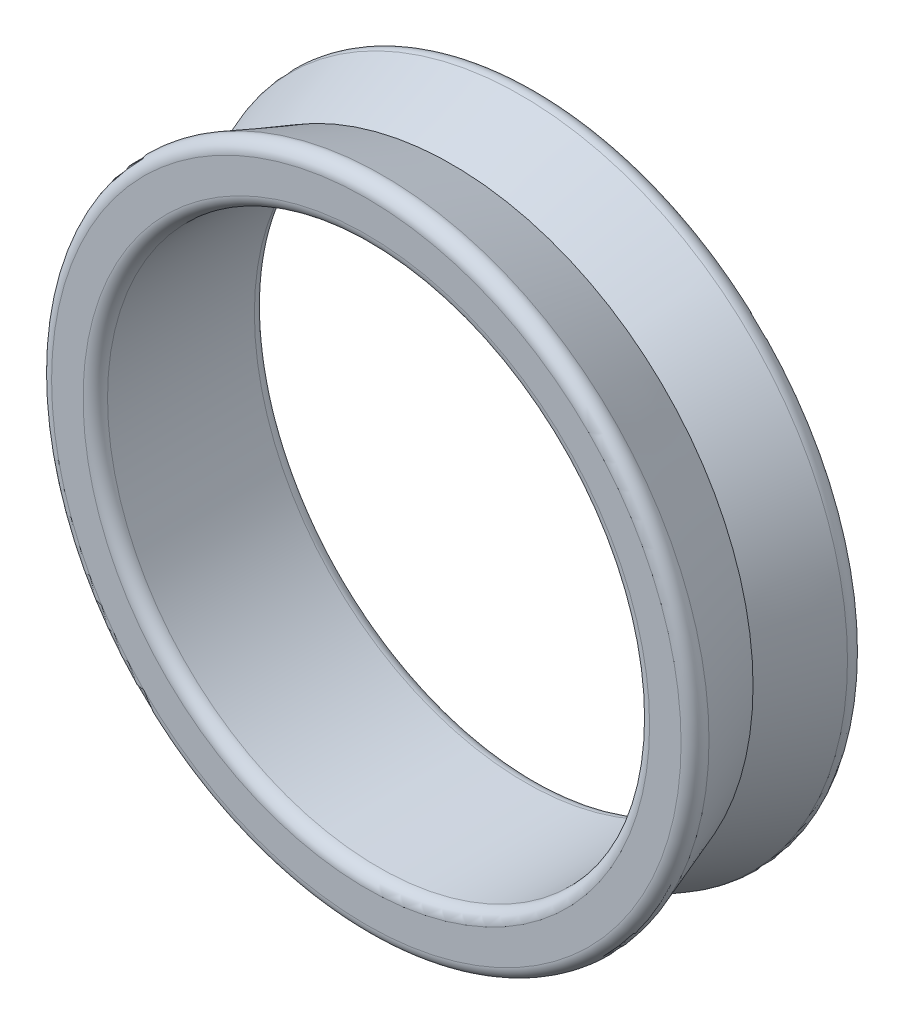
ISO-10303-21;
HEADER;
FILE_DESCRIPTION(('STEP AP214'),'2;1');
FILE_NAME('part.step','',(''),(''),'','','');
FILE_SCHEMA(('AUTOMOTIVE_DESIGN { 1 0 10303 214 1 1 1 1 }'));
ENDSEC;
DATA;
#1=APPLICATION_CONTEXT('core data for automotive mechanical design processes');
#2=APPLICATION_PROTOCOL_DEFINITION('international standard','automotive_design',2000,#1);
#3=PRODUCT_CONTEXT('',#1,'mechanical');
#4=PRODUCT('Part','Part','',(#3));
#5=PRODUCT_RELATED_PRODUCT_CATEGORY('part','',(#4));
#6=PRODUCT_DEFINITION_FORMATION('','',#4);
#7=PRODUCT_DEFINITION_CONTEXT('part definition',#1,'design');
#8=PRODUCT_DEFINITION('design','',#6,#7);
#9=PRODUCT_DEFINITION_SHAPE('','',#8);
#10=(LENGTH_UNIT() NAMED_UNIT(*) SI_UNIT(.MILLI.,.METRE.));
#11=(NAMED_UNIT(*) PLANE_ANGLE_UNIT() SI_UNIT($,.RADIAN.));
#12=(NAMED_UNIT(*) SI_UNIT($,.STERADIAN.) SOLID_ANGLE_UNIT());
#13=UNCERTAINTY_MEASURE_WITH_UNIT(LENGTH_MEASURE(1.E-05),#10,'distance_accuracy_value','');
#14=(GEOMETRIC_REPRESENTATION_CONTEXT(3) GLOBAL_UNCERTAINTY_ASSIGNED_CONTEXT((#13)) GLOBAL_UNIT_ASSIGNED_CONTEXT((#10,
#11,#12)) REPRESENTATION_CONTEXT('',''));
#15=CARTESIAN_POINT('',(0.,0.,0.));
#16=DIRECTION('',(0.,0.,1.));
#17=DIRECTION('',(1.,0.,0.));
#18=AXIS2_PLACEMENT_3D('',#15,#16,#17);
#19=CARTESIAN_POINT('',(0.,0.,7.));
#20=DIRECTION('',(0.,0.,1.));
#21=DIRECTION('',(1.,0.,0.));
#22=AXIS2_PLACEMENT_3D('',#19,#20,#21);
#23=PLANE('',#22);
#24=CARTESIAN_POINT('',(0.,0.,7.));
#25=DIRECTION('',(0.,0.,1.));
#26=DIRECTION('',(1.,0.,0.));
#27=AXIS2_PLACEMENT_3D('',#24,#25,#26);
#28=CIRCLE('',#27,11.575);
#29=CARTESIAN_POINT('',(11.575,0.,7.));
#30=VERTEX_POINT('',#29);
#31=EDGE_CURVE('E41',#30,#30,#28,.F.);
#32=ORIENTED_EDGE('',*,*,#31,.T.);
#33=EDGE_LOOP('',(#32));
#34=FACE_BOUND('',#33,.T.);
#35=CARTESIAN_POINT('',(0.,0.,7.));
#36=DIRECTION('',(0.,0.,1.));
#37=DIRECTION('',(1.,0.,0.));
#38=AXIS2_PLACEMENT_3D('',#35,#36,#37);
#39=CIRCLE('',#38,12.8609259966289);
#40=CARTESIAN_POINT('',(12.8609259966289,0.,7.));
#41=VERTEX_POINT('',#40);
#42=EDGE_CURVE('E60',#41,#41,#39,.T.);
#43=ORIENTED_EDGE('',*,*,#42,.T.);
#44=EDGE_LOOP('',(#43));
#45=FACE_BOUND('',#44,.T.);
#46=ADVANCED_FACE('F34',(#34,#45),#23,.T.);
#47=CARTESIAN_POINT('',(0.,0.,0.));
#48=DIRECTION('',(0.,0.,1.));
#49=DIRECTION('',(1.,0.,0.));
#50=AXIS2_PLACEMENT_3D('',#47,#48,#49);
#51=PLANE('',#50);
#52=CARTESIAN_POINT('',(0.,0.,0.));
#53=DIRECTION('',(0.,0.,1.));
#54=DIRECTION('',(1.,0.,0.));
#55=AXIS2_PLACEMENT_3D('',#52,#53,#54);
#56=CIRCLE('',#55,11.575);
#57=CARTESIAN_POINT('',(11.575,0.,0.));
#58=VERTEX_POINT('',#57);
#59=EDGE_CURVE('E10',#58,#58,#56,.T.);
#60=ORIENTED_EDGE('',*,*,#59,.T.);
#61=EDGE_LOOP('',(#60));
#62=FACE_BOUND('',#61,.T.);
#63=CARTESIAN_POINT('',(0.,0.,0.));
#64=DIRECTION('',(0.,0.,1.));
#65=DIRECTION('',(1.,0.,0.));
#66=AXIS2_PLACEMENT_3D('',#63,#64,#65);
#67=CIRCLE('',#66,12.8609259966289);
#68=CARTESIAN_POINT('',(12.8609259966289,0.,0.));
#69=VERTEX_POINT('',#68);
#70=EDGE_CURVE('E57',#69,#69,#67,.F.);
#71=ORIENTED_EDGE('',*,*,#70,.T.);
#72=EDGE_LOOP('',(#71));
#73=FACE_BOUND('',#72,.T.);
#74=ADVANCED_FACE('F88',(#62,#73),#51,.F.);
#75=CARTESIAN_POINT('',(0.,0.,7.));
#76=DIRECTION('',(0.,0.,-1.));
#77=DIRECTION('',(-1.,0.,0.));
#78=AXIS2_PLACEMENT_3D('',#75,#76,#77);
#79=CYLINDRICAL_SURFACE('',#78,11.075);
#80=CARTESIAN_POINT('',(0.,0.,6.5));
#81=DIRECTION('',(0.,0.,1.));
#82=DIRECTION('',(1.,0.,0.));
#83=AXIS2_PLACEMENT_3D('',#80,#81,#82);
#84=CIRCLE('',#83,11.075);
#85=CARTESIAN_POINT('',(11.075,0.,6.5));
#86=VERTEX_POINT('',#85);
#87=EDGE_CURVE('E45',#86,#86,#84,.T.);
#88=ORIENTED_EDGE('',*,*,#87,.T.);
#89=EDGE_LOOP('',(#88));
#90=FACE_BOUND('',#89,.T.);
#91=CARTESIAN_POINT('',(0.,0.,0.5));
#92=DIRECTION('',(0.,0.,1.));
#93=DIRECTION('',(1.,0.,0.));
#94=AXIS2_PLACEMENT_3D('',#91,#92,#93);
#95=CIRCLE('',#94,11.075);
#96=CARTESIAN_POINT('',(11.075,0.,0.5));
#97=VERTEX_POINT('',#96);
#98=EDGE_CURVE('E49',#97,#97,#95,.F.);
#99=ORIENTED_EDGE('',*,*,#98,.T.);
#100=EDGE_LOOP('',(#99));
#101=FACE_BOUND('',#100,.T.);
#102=ADVANCED_FACE('F84',(#90,#101),#79,.F.);
#103=CARTESIAN_POINT('',(0.,0.,0.));
#104=DIRECTION('',(0.,0.,-1.));
#105=DIRECTION('',(-1.,0.,0.));
#106=AXIS2_PLACEMENT_3D('',#103,#104,#105);
#107=CONICAL_SURFACE('',#106,13.575,0.349065850398867);
#108=CARTESIAN_POINT('',(0.,0.,0.671010071662835));
#109=DIRECTION('',(0.,0.,-1.));
#110=DIRECTION('',(-1.,0.,0.));
#111=AXIS2_PLACEMENT_3D('',#108,#109,#110);
#112=CIRCLE('',#111,13.3307723070219);
#113=CARTESIAN_POINT('',(-13.3307723070219,0.,0.671010071662835));
#114=VERTEX_POINT('',#113);
#115=EDGE_CURVE('E54',#114,#114,#112,.F.);
#116=ORIENTED_EDGE('',*,*,#115,.T.);
#117=EDGE_LOOP('',(#116));
#118=FACE_BOUND('',#117,.T.);
#119=CARTESIAN_POINT('',(0.,0.,3.5));
#120=DIRECTION('',(0.,0.,-1.));
#121=DIRECTION('',(-1.,0.,0.));
#122=AXIS2_PLACEMENT_3D('',#119,#120,#121);
#123=CIRCLE('',#122,12.3011041800683);
#124=CARTESIAN_POINT('',(-12.3011041800683,0.,3.5));
#125=VERTEX_POINT('',#124);
#126=EDGE_CURVE('E66',#125,#125,#123,.T.);
#127=ORIENTED_EDGE('',*,*,#126,.T.);
#128=EDGE_LOOP('',(#127));
#129=FACE_BOUND('',#128,.T.);
#130=ADVANCED_FACE('F70',(#118,#129),#107,.T.);
#131=CARTESIAN_POINT('',(0.,0.,3.5));
#132=DIRECTION('',(0.,0.,1.));
#133=DIRECTION('',(1.,0.,0.));
#134=AXIS2_PLACEMENT_3D('',#131,#132,#133);
#135=CONICAL_SURFACE('',#134,12.3011041800683,0.349065850398867);
#136=CARTESIAN_POINT('',(0.,0.,6.32898992833716));
#137=DIRECTION('',(0.,0.,-1.));
#138=DIRECTION('',(-1.,0.,0.));
#139=AXIS2_PLACEMENT_3D('',#136,#137,#138);
#140=CIRCLE('',#139,13.3307723070219);
#141=CARTESIAN_POINT('',(-13.3307723070219,0.,6.32898992833716));
#142=VERTEX_POINT('',#141);
#143=EDGE_CURVE('E63',#142,#142,#140,.T.);
#144=ORIENTED_EDGE('',*,*,#143,.T.);
#145=EDGE_LOOP('',(#144));
#146=FACE_BOUND('',#145,.T.);
#147=ORIENTED_EDGE('',*,*,#126,.F.);
#148=EDGE_LOOP('',(#147));
#149=FACE_BOUND('',#148,.T.);
#150=ADVANCED_FACE('F72',(#146,#149),#135,.T.);
#151=CARTESIAN_POINT('',(0.,0.,6.5));
#152=DIRECTION('',(0.,0.,1.));
#153=DIRECTION('',(1.,0.,0.));
#154=AXIS2_PLACEMENT_3D('',#151,#152,#153);
#155=TOROIDAL_SURFACE('',#154,12.8609259966289,0.5);
#156=ORIENTED_EDGE('',*,*,#42,.F.);
#157=EDGE_LOOP('',(#156));
#158=FACE_BOUND('',#157,.T.);
#159=ORIENTED_EDGE('',*,*,#143,.F.);
#160=EDGE_LOOP('',(#159));
#161=FACE_BOUND('',#160,.T.);
#162=ADVANCED_FACE('F74',(#158,#161),#155,.T.);
#163=CARTESIAN_POINT('',(0.,0.,0.5));
#164=DIRECTION('',(0.,0.,1.));
#165=DIRECTION('',(1.,0.,0.));
#166=AXIS2_PLACEMENT_3D('',#163,#164,#165);
#167=TOROIDAL_SURFACE('',#166,12.8609259966289,0.5);
#168=ORIENTED_EDGE('',*,*,#115,.F.);
#169=EDGE_LOOP('',(#168));
#170=FACE_BOUND('',#169,.T.);
#171=ORIENTED_EDGE('',*,*,#70,.F.);
#172=EDGE_LOOP('',(#171));
#173=FACE_BOUND('',#172,.T.);
#174=ADVANCED_FACE('F81',(#170,#173),#167,.T.);
#175=CARTESIAN_POINT('',(0.,0.,6.5));
#176=DIRECTION('',(0.,0.,1.));
#177=DIRECTION('',(1.,0.,0.));
#178=AXIS2_PLACEMENT_3D('',#175,#176,#177);
#179=TOROIDAL_SURFACE('',#178,11.575,0.5);
#180=ORIENTED_EDGE('',*,*,#31,.F.);
#181=EDGE_LOOP('',(#180));
#182=FACE_BOUND('',#181,.T.);
#183=ORIENTED_EDGE('',*,*,#87,.F.);
#184=EDGE_LOOP('',(#183));
#185=FACE_BOUND('',#184,.T.);
#186=ADVANCED_FACE('F98',(#182,#185),#179,.T.);
#187=CARTESIAN_POINT('',(0.,0.,0.5));
#188=DIRECTION('',(0.,0.,1.));
#189=DIRECTION('',(1.,0.,0.));
#190=AXIS2_PLACEMENT_3D('',#187,#188,#189);
#191=TOROIDAL_SURFACE('',#190,11.575,0.5);
#192=ORIENTED_EDGE('',*,*,#98,.F.);
#193=EDGE_LOOP('',(#192));
#194=FACE_BOUND('',#193,.T.);
#195=ORIENTED_EDGE('',*,*,#59,.F.);
#196=EDGE_LOOP('',(#195));
#197=FACE_BOUND('',#196,.T.);
#198=ADVANCED_FACE('F36',(#194,#197),#191,.T.);
#199=CLOSED_SHELL('',(#46,#74,#102,#130,#150,#162,#174,#186,#198));
#200=MANIFOLD_SOLID_BREP('B2',#199);
#201=ADVANCED_BREP_SHAPE_REPRESENTATION('',(#18,#200),#14);
#202=SHAPE_DEFINITION_REPRESENTATION(#9,#201);
ENDSEC;
END-ISO-10303-21;
